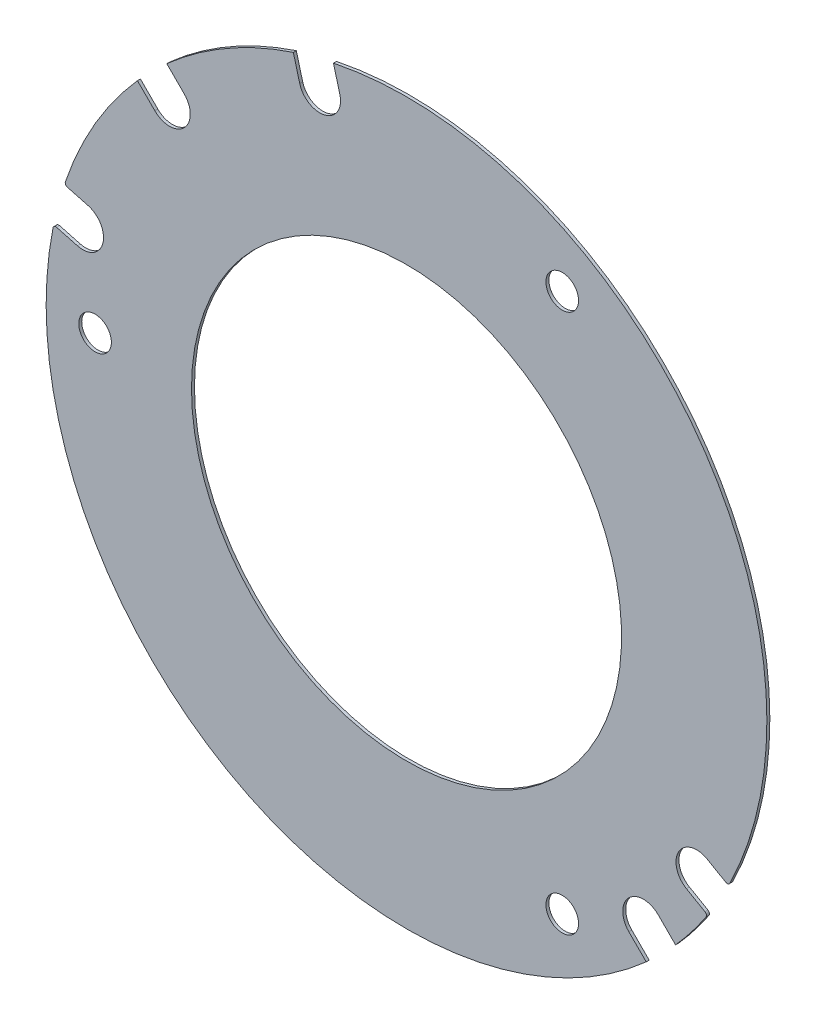
ISO-10303-21;
HEADER;
FILE_DESCRIPTION(('STEP AP214'),'2;1');
FILE_NAME('part.step','',(''),(''),'','','');
FILE_SCHEMA(('AUTOMOTIVE_DESIGN { 1 0 10303 214 1 1 1 1 }'));
ENDSEC;
DATA;
#1=APPLICATION_CONTEXT('core data for automotive mechanical design processes');
#2=APPLICATION_PROTOCOL_DEFINITION('international standard','automotive_design',2000,#1);
#3=PRODUCT_CONTEXT('',#1,'mechanical');
#4=PRODUCT('Part','Part','',(#3));
#5=PRODUCT_RELATED_PRODUCT_CATEGORY('part','',(#4));
#6=PRODUCT_DEFINITION_FORMATION('','',#4);
#7=PRODUCT_DEFINITION_CONTEXT('part definition',#1,'design');
#8=PRODUCT_DEFINITION('design','',#6,#7);
#9=PRODUCT_DEFINITION_SHAPE('','',#8);
#10=(LENGTH_UNIT() NAMED_UNIT(*) SI_UNIT(.MILLI.,.METRE.));
#11=(NAMED_UNIT(*) PLANE_ANGLE_UNIT() SI_UNIT($,.RADIAN.));
#12=(NAMED_UNIT(*) SI_UNIT($,.STERADIAN.) SOLID_ANGLE_UNIT());
#13=UNCERTAINTY_MEASURE_WITH_UNIT(LENGTH_MEASURE(1.E-05),#10,'distance_accuracy_value','');
#14=(GEOMETRIC_REPRESENTATION_CONTEXT(3) GLOBAL_UNCERTAINTY_ASSIGNED_CONTEXT((#13)) GLOBAL_UNIT_ASSIGNED_CONTEXT((#10,
#11,#12)) REPRESENTATION_CONTEXT('',''));
#15=CARTESIAN_POINT('',(0.,0.,0.));
#16=DIRECTION('',(0.,0.,1.));
#17=DIRECTION('',(1.,0.,0.));
#18=AXIS2_PLACEMENT_3D('',#15,#16,#17);
#19=CARTESIAN_POINT('',(0.,0.,0.));
#20=DIRECTION('',(0.,0.,-1.));
#21=DIRECTION('',(-1.,0.,0.));
#22=AXIS2_PLACEMENT_3D('',#19,#20,#21);
#23=PLANE('',#22);
#24=CARTESIAN_POINT('',(52.5,90.932667397366,0.));
#25=DIRECTION('',(0.,0.,-1.));
#26=DIRECTION('',(-1.,0.,0.));
#27=AXIS2_PLACEMENT_3D('',#24,#25,#26);
#28=CIRCLE('',#27,5.5);
#29=CARTESIAN_POINT('',(47.,90.932667397366,0.));
#30=VERTEX_POINT('',#29);
#31=EDGE_CURVE('E293',#30,#30,#28,.F.);
#32=ORIENTED_EDGE('',*,*,#31,.T.);
#33=EDGE_LOOP('',(#32));
#34=FACE_BOUND('',#33,.T.);
#35=CARTESIAN_POINT('',(52.5,-90.9326673973661,0.));
#36=DIRECTION('',(0.,0.,-1.));
#37=DIRECTION('',(-1.,0.,0.));
#38=AXIS2_PLACEMENT_3D('',#35,#36,#37);
#39=CIRCLE('',#38,5.5);
#40=CARTESIAN_POINT('',(47.,-90.9326673973661,0.));
#41=VERTEX_POINT('',#40);
#42=EDGE_CURVE('E296',#41,#41,#39,.F.);
#43=ORIENTED_EDGE('',*,*,#42,.T.);
#44=EDGE_LOOP('',(#43));
#45=FACE_BOUND('',#44,.T.);
#46=CARTESIAN_POINT('',(-105.,0.,0.));
#47=DIRECTION('',(0.,0.,-1.));
#48=DIRECTION('',(-1.,0.,0.));
#49=AXIS2_PLACEMENT_3D('',#46,#47,#48);
#50=CIRCLE('',#49,5.5);
#51=CARTESIAN_POINT('',(-110.5,0.,0.));
#52=VERTEX_POINT('',#51);
#53=EDGE_CURVE('E299',#52,#52,#50,.F.);
#54=ORIENTED_EDGE('',*,*,#53,.T.);
#55=EDGE_LOOP('',(#54));
#56=FACE_BOUND('',#55,.T.);
#57=CARTESIAN_POINT('',(0.,0.,0.));
#58=DIRECTION('',(0.,0.,-1.));
#59=DIRECTION('',(-1.,0.,0.));
#60=AXIS2_PLACEMENT_3D('',#57,#58,#59);
#61=CIRCLE('',#60,72.5);
#62=CARTESIAN_POINT('',(-72.5,0.,0.));
#63=VERTEX_POINT('',#62);
#64=EDGE_CURVE('E200',#63,#63,#61,.F.);
#65=ORIENTED_EDGE('',*,*,#64,.T.);
#66=EDGE_LOOP('',(#65));
#67=FACE_BOUND('',#66,.T.);
#68=DIRECTION('',(-0.707106781186546,0.707106781186549,0.));
#69=VECTOR('',#68,1.);
#70=CARTESIAN_POINT('',(84.8528137423857,-74.953318805774,0.));
#71=LINE('',#70,#69);
#72=CARTESIAN_POINT('',(90.7205175476283,-80.8210226110166,0.));
#73=VERTEX_POINT('',#72);
#74=CARTESIAN_POINT('',(84.8528137423857,-74.953318805774,0.));
#75=VERTEX_POINT('',#74);
#76=EDGE_CURVE('E201',#73,#75,#71,.T.);
#77=ORIENTED_EDGE('',*,*,#76,.T.);
#78=CARTESIAN_POINT('',(79.9030662740799,-79.9030662740799,0.));
#79=DIRECTION('',(0.,0.,1.));
#80=DIRECTION('',(1.,0.,0.));
#81=AXIS2_PLACEMENT_3D('',#78,#79,#80);
#82=CIRCLE('',#81,7.);
#83=CARTESIAN_POINT('',(74.9533188057741,-84.8528137423857,0.));
#84=VERTEX_POINT('',#83);
#85=EDGE_CURVE('E304',#75,#84,#82,.T.);
#86=ORIENTED_EDGE('',*,*,#85,.T.);
#87=DIRECTION('',(0.707106781186547,-0.707106781186548,0.));
#88=VECTOR('',#87,1.);
#89=CARTESIAN_POINT('',(80.8210226110167,-90.7205175476283,0.));
#90=LINE('',#89,#88);
#91=CARTESIAN_POINT('',(80.8210226110167,-90.7205175476283,0.));
#92=VERTEX_POINT('',#91);
#93=EDGE_CURVE('E186',#84,#92,#90,.T.);
#94=ORIENTED_EDGE('',*,*,#93,.T.);
#95=CARTESIAN_POINT('',(0.,0.,0.));
#96=DIRECTION('',(0.,0.,1.));
#97=DIRECTION('',(1.,0.,0.));
#98=AXIS2_PLACEMENT_3D('',#95,#96,#97);
#99=CIRCLE('',#98,121.5);
#100=CARTESIAN_POINT('',(-119.188797486006,23.5856005613564,0.));
#101=VERTEX_POINT('',#100);
#102=EDGE_CURVE('E19',#101,#92,#99,.T.);
#103=ORIENTED_EDGE('',*,*,#102,.F.);
#104=CARTESIAN_POINT('',(-118.20781972892,23.3914803921271,0.));
#105=DIRECTION('',(0.,0.,-1.));
#106=DIRECTION('',(-1.,0.,0.));
#107=AXIS2_PLACEMENT_3D('',#104,#105,#106);
#108=CIRCLE('',#107,1.);
#109=CARTESIAN_POINT('',(-117.949000683817,24.3574062184163,0.));
#110=VERTEX_POINT('',#109);
#111=EDGE_CURVE('E175',#110,#101,#108,.F.);
#112=ORIENTED_EDGE('',*,*,#111,.F.);
#113=DIRECTION('',(0.965925826289069,-0.25881904510252,0.));
#114=VECTOR('',#113,1.);
#115=CARTESIAN_POINT('',(-118.976784146226,24.6327999671628,0.));
#116=LINE('',#115,#114);
#117=CARTESIAN_POINT('',(-110.961351686382,22.4850713125614,0.));
#118=VERTEX_POINT('',#117);
#119=EDGE_CURVE('E193',#110,#118,#116,.T.);
#120=ORIENTED_EDGE('',*,*,#119,.T.);
#121=CARTESIAN_POINT('',(-109.149618370665,29.2465520965848,0.));
#122=DIRECTION('',(0.,0.,-1.));
#123=DIRECTION('',(-1.,0.,0.));
#124=AXIS2_PLACEMENT_3D('',#121,#122,#123);
#125=CIRCLE('',#124,7.);
#126=CARTESIAN_POINT('',(-107.337885054947,36.0080328806083,0.));
#127=VERTEX_POINT('',#126);
#128=EDGE_CURVE('E331',#118,#127,#125,.F.);
#129=ORIENTED_EDGE('',*,*,#128,.T.);
#130=DIRECTION('',(-0.965925826289068,0.258819045102521,0.));
#131=VECTOR('',#130,1.);
#132=CARTESIAN_POINT('',(-107.337885054947,36.0080328806083,0.));
#133=LINE('',#132,#131);
#134=CARTESIAN_POINT('',(-114.325534052382,37.8803677864631,0.));
#135=VERTEX_POINT('',#134);
#136=EDGE_CURVE('E231',#127,#135,#133,.T.);
#137=ORIENTED_EDGE('',*,*,#136,.T.);
#138=CARTESIAN_POINT('',(-114.066715007279,38.8462936127521,0.));
#139=DIRECTION('',(0.,0.,1.));
#140=DIRECTION('',(1.,0.,0.));
#141=AXIS2_PLACEMENT_3D('',#138,#139,#140);
#142=CIRCLE('',#141,1.);
#143=CARTESIAN_POINT('',(-115.013326750078,39.1686694933559,0.));
#144=VERTEX_POINT('',#143);
#145=EDGE_CURVE('E233',#144,#135,#142,.T.);
#146=ORIENTED_EDGE('',*,*,#145,.F.);
#147=CARTESIAN_POINT('',(0.,0.,0.));
#148=DIRECTION('',(0.,0.,1.));
#149=DIRECTION('',(1.,0.,0.));
#150=AXIS2_PLACEMENT_3D('',#147,#148,#149);
#151=CIRCLE('',#150,121.5);
#152=CARTESIAN_POINT('',(-90.7205175476283,80.8210226110166,0.));
#153=VERTEX_POINT('',#152);
#154=EDGE_CURVE('E326',#153,#144,#151,.T.);
#155=ORIENTED_EDGE('',*,*,#154,.F.);
#156=DIRECTION('',(0.707106781186548,-0.707106781186547,0.));
#157=VECTOR('',#156,1.);
#158=CARTESIAN_POINT('',(-90.7205175476283,80.8210226110166,0.));
#159=LINE('',#158,#157);
#160=CARTESIAN_POINT('',(-84.8528137423857,74.953318805774,0.));
#161=VERTEX_POINT('',#160);
#162=EDGE_CURVE('E227',#153,#161,#159,.T.);
#163=ORIENTED_EDGE('',*,*,#162,.T.);
#164=CARTESIAN_POINT('',(-79.9030662740799,79.9030662740799,0.));
#165=DIRECTION('',(0.,0.,-1.));
#166=DIRECTION('',(-1.,0.,0.));
#167=AXIS2_PLACEMENT_3D('',#164,#165,#166);
#168=CIRCLE('',#167,7.);
#169=CARTESIAN_POINT('',(-74.953318805774,84.8528137423857,0.));
#170=VERTEX_POINT('',#169);
#171=EDGE_CURVE('E324',#161,#170,#168,.F.);
#172=ORIENTED_EDGE('',*,*,#171,.T.);
#173=DIRECTION('',(-0.707106781186547,0.707106781186548,0.));
#174=VECTOR('',#173,1.);
#175=CARTESIAN_POINT('',(-74.953318805774,84.8528137423857,0.));
#176=LINE('',#175,#174);
#177=CARTESIAN_POINT('',(-80.8210226110166,90.7205175476283,0.));
#178=VERTEX_POINT('',#177);
#179=EDGE_CURVE('E223',#170,#178,#176,.T.);
#180=ORIENTED_EDGE('',*,*,#179,.T.);
#181=CARTESIAN_POINT('',(0.,0.,0.));
#182=DIRECTION('',(0.,0.,1.));
#183=DIRECTION('',(1.,0.,0.));
#184=AXIS2_PLACEMENT_3D('',#181,#182,#183);
#185=CIRCLE('',#184,121.5);
#186=CARTESIAN_POINT('',(-38.1557615352097,115.353317514791,0.));
#187=VERTEX_POINT('',#186);
#188=EDGE_CURVE('E321',#187,#178,#185,.T.);
#189=ORIENTED_EDGE('',*,*,#188,.F.);
#190=DIRECTION('',(0.258819045102522,-0.965925826289068,0.));
#191=VECTOR('',#190,1.);
#192=CARTESIAN_POINT('',(-38.1557615352097,115.353317514791,0.));
#193=LINE('',#192,#191);
#194=CARTESIAN_POINT('',(-36.0080328806083,107.337885054947,0.));
#195=VERTEX_POINT('',#194);
#196=EDGE_CURVE('E219',#187,#195,#193,.T.);
#197=ORIENTED_EDGE('',*,*,#196,.T.);
#198=CARTESIAN_POINT('',(-29.2465520965849,109.149618370665,0.));
#199=DIRECTION('',(0.,0.,-1.));
#200=DIRECTION('',(-1.,0.,0.));
#201=AXIS2_PLACEMENT_3D('',#198,#199,#200);
#202=CIRCLE('',#201,7.);
#203=CARTESIAN_POINT('',(-22.4850713125615,110.961351686382,0.));
#204=VERTEX_POINT('',#203);
#205=EDGE_CURVE('E319',#195,#204,#202,.F.);
#206=ORIENTED_EDGE('',*,*,#205,.T.);
#207=DIRECTION('',(-0.258819045102521,0.965925826289068,0.));
#208=VECTOR('',#207,1.);
#209=CARTESIAN_POINT('',(-22.4850713125614,110.961351686382,0.));
#210=LINE('',#209,#208);
#211=CARTESIAN_POINT('',(-24.6327999671629,118.976784146226,0.));
#212=VERTEX_POINT('',#211);
#213=EDGE_CURVE('E214',#204,#212,#210,.T.);
#214=ORIENTED_EDGE('',*,*,#213,.T.);
#215=CARTESIAN_POINT('',(0.,0.,0.));
#216=DIRECTION('',(0.,0.,1.));
#217=DIRECTION('',(1.,0.,0.));
#218=AXIS2_PLACEMENT_3D('',#215,#216,#217);
#219=CIRCLE('',#218,121.5);
#220=CARTESIAN_POINT('',(109.023135080611,-53.6302714629978,0.));
#221=VERTEX_POINT('',#220);
#222=EDGE_CURVE('E217',#221,#212,#219,.T.);
#223=ORIENTED_EDGE('',*,*,#222,.F.);
#224=CARTESIAN_POINT('',(108.125825326861,-53.1888700517797,0.));
#225=DIRECTION('',(0.,0.,-1.));
#226=DIRECTION('',(-1.,0.,0.));
#227=AXIS2_PLACEMENT_3D('',#224,#225,#226);
#228=CIRCLE('',#227,1.);
#229=CARTESIAN_POINT('',(107.625825326861,-54.0548954555639,0.));
#230=VERTEX_POINT('',#229);
#231=EDGE_CURVE('E315',#230,#221,#228,.F.);
#232=ORIENTED_EDGE('',*,*,#231,.F.);
#233=DIRECTION('',(-0.866025403784438,0.500000000000002,0.));
#234=VECTOR('',#233,1.);
#235=CARTESIAN_POINT('',(101.360870627642,-50.4378221735089,0.));
#236=LINE('',#235,#234);
#237=CARTESIAN_POINT('',(101.360870627642,-50.4378221735089,0.));
#238=VERTEX_POINT('',#237);
#239=EDGE_CURVE('E210',#230,#238,#236,.T.);
#240=ORIENTED_EDGE('',*,*,#239,.T.);
#241=CARTESIAN_POINT('',(97.8608706276416,-56.5,0.));
#242=DIRECTION('',(0.,0.,1.));
#243=DIRECTION('',(1.,0.,0.));
#244=AXIS2_PLACEMENT_3D('',#241,#242,#243);
#245=CIRCLE('',#244,7.);
#246=CARTESIAN_POINT('',(94.3608706276415,-62.5621778264912,0.));
#247=VERTEX_POINT('',#246);
#248=EDGE_CURVE('E312',#238,#247,#245,.T.);
#249=ORIENTED_EDGE('',*,*,#248,.T.);
#250=DIRECTION('',(0.866025403784439,-0.5,0.));
#251=VECTOR('',#250,1.);
#252=CARTESIAN_POINT('',(101.547310769957,-66.7112709771722,0.));
#253=LINE('',#252,#251);
#254=CARTESIAN_POINT('',(100.625825326861,-66.1792511085463,0.));
#255=VERTEX_POINT('',#254);
#256=EDGE_CURVE('E205',#247,#255,#253,.T.);
#257=ORIENTED_EDGE('',*,*,#256,.T.);
#258=CARTESIAN_POINT('',(100.125825326861,-67.0452765123307,0.));
#259=DIRECTION('',(0.,0.,1.));
#260=DIRECTION('',(1.,0.,0.));
#261=AXIS2_PLACEMENT_3D('',#258,#259,#260);
#262=CIRCLE('',#261,1.);
#263=CARTESIAN_POINT('',(100.956745039117,-67.6016688485327,0.));
#264=VERTEX_POINT('',#263);
#265=EDGE_CURVE('E208',#264,#255,#262,.T.);
#266=ORIENTED_EDGE('',*,*,#265,.F.);
#267=CARTESIAN_POINT('',(0.,0.,0.));
#268=DIRECTION('',(0.,0.,1.));
#269=DIRECTION('',(1.,0.,0.));
#270=AXIS2_PLACEMENT_3D('',#267,#268,#269);
#271=CIRCLE('',#270,121.5);
#272=EDGE_CURVE('E307',#73,#264,#271,.T.);
#273=ORIENTED_EDGE('',*,*,#272,.F.);
#274=EDGE_LOOP('',(#77,#86,#94,#103,#112,#120,#129,#137,#146,#155,#163,#172,#180,#189,#197,#206,
#214,#223,#232,#240,#249,#257,#266,#273));
#275=FACE_BOUND('',#274,.T.);
#276=ADVANCED_FACE('F16',(#34,#45,#56,#67,#275),#23,.T.);
#277=CARTESIAN_POINT('',(0.,0.,0.));
#278=DIRECTION('',(0.,0.,1.));
#279=DIRECTION('',(1.,0.,0.));
#280=AXIS2_PLACEMENT_3D('',#277,#278,#279);
#281=CYLINDRICAL_SURFACE('',#280,121.5);
#282=DIRECTION('',(0.,0.,-1.));
#283=VECTOR('',#282,1.);
#284=CARTESIAN_POINT('',(-119.188797486006,23.5856005613564,0.));
#285=LINE('',#284,#283);
#286=CARTESIAN_POINT('',(-119.188797486006,23.5856005613564,1.));
#287=VERTEX_POINT('',#286);
#288=EDGE_CURVE('E180',#101,#287,#285,.F.);
#289=ORIENTED_EDGE('',*,*,#288,.F.);
#290=ORIENTED_EDGE('',*,*,#102,.T.);
#291=DIRECTION('',(0.,0.,1.));
#292=VECTOR('',#291,1.);
#293=CARTESIAN_POINT('',(80.8210226110167,-90.7205175476283,1.));
#294=LINE('',#293,#292);
#295=CARTESIAN_POINT('',(80.8210226110167,-90.7205175476283,1.));
#296=VERTEX_POINT('',#295);
#297=EDGE_CURVE('E306',#92,#296,#294,.T.);
#298=ORIENTED_EDGE('',*,*,#297,.T.);
#299=CARTESIAN_POINT('',(0.,0.,1.));
#300=DIRECTION('',(0.,0.,1.));
#301=DIRECTION('',(1.,0.,0.));
#302=AXIS2_PLACEMENT_3D('',#299,#300,#301);
#303=CIRCLE('',#302,121.5);
#304=EDGE_CURVE('E192',#296,#287,#303,.F.);
#305=ORIENTED_EDGE('',*,*,#304,.T.);
#306=EDGE_LOOP('',(#289,#290,#298,#305));
#307=FACE_BOUND('',#306,.T.);
#308=ADVANCED_FACE('F191',(#307),#281,.T.);
#309=CARTESIAN_POINT('',(-118.20781972892,23.3914803921271,0.));
#310=DIRECTION('',(0.,0.,-1.));
#311=DIRECTION('',(-1.,0.,0.));
#312=AXIS2_PLACEMENT_3D('',#309,#310,#311);
#313=CYLINDRICAL_SURFACE('',#312,1.);
#314=CARTESIAN_POINT('',(-118.20781972892,23.3914803921271,1.));
#315=DIRECTION('',(0.,0.,-1.));
#316=DIRECTION('',(-1.,0.,0.));
#317=AXIS2_PLACEMENT_3D('',#314,#315,#316);
#318=CIRCLE('',#317,1.);
#319=CARTESIAN_POINT('',(-117.949000683817,24.3574062184162,1.));
#320=VERTEX_POINT('',#319);
#321=EDGE_CURVE('E290',#287,#320,#318,.T.);
#322=ORIENTED_EDGE('',*,*,#321,.T.);
#323=DIRECTION('',(0.,0.,1.));
#324=VECTOR('',#323,1.);
#325=CARTESIAN_POINT('',(-117.949000683817,24.3574062184162,1.));
#326=LINE('',#325,#324);
#327=EDGE_CURVE('E182',#320,#110,#326,.F.);
#328=ORIENTED_EDGE('',*,*,#327,.T.);
#329=ORIENTED_EDGE('',*,*,#111,.T.);
#330=ORIENTED_EDGE('',*,*,#288,.T.);
#331=EDGE_LOOP('',(#322,#328,#329,#330));
#332=FACE_BOUND('',#331,.T.);
#333=ADVANCED_FACE('F178',(#332),#313,.T.);
#334=CARTESIAN_POINT('',(-118.976784146226,24.6327999671628,1.));
#335=DIRECTION('',(-0.25881904510252,-0.965925826289069,0.));
#336=DIRECTION('',(0.965925826289069,-0.25881904510252,0.));
#337=AXIS2_PLACEMENT_3D('',#334,#335,#336);
#338=PLANE('',#337);
#339=DIRECTION('',(0.965925826289074,-0.258819045102501,0.));
#340=VECTOR('',#339,1.);
#341=CARTESIAN_POINT('',(-117.949000683817,24.3574062184161,1.));
#342=LINE('',#341,#340);
#343=CARTESIAN_POINT('',(-110.961351686382,22.4850713125613,1.));
#344=VERTEX_POINT('',#343);
#345=EDGE_CURVE('E289',#320,#344,#342,.T.);
#346=ORIENTED_EDGE('',*,*,#345,.T.);
#347=DIRECTION('',(0.,0.,-1.));
#348=VECTOR('',#347,1.);
#349=CARTESIAN_POINT('',(-110.961351686382,22.4850713125612,1.));
#350=LINE('',#349,#348);
#351=EDGE_CURVE('E332',#344,#118,#350,.T.);
#352=ORIENTED_EDGE('',*,*,#351,.T.);
#353=ORIENTED_EDGE('',*,*,#119,.F.);
#354=ORIENTED_EDGE('',*,*,#327,.F.);
#355=EDGE_LOOP('',(#346,#352,#353,#354));
#356=FACE_BOUND('',#355,.T.);
#357=ADVANCED_FACE('F474',(#356),#338,.F.);
#358=CARTESIAN_POINT('',(-109.149618370665,29.2465520965848,1.));
#359=DIRECTION('',(0.,0.,-1.));
#360=DIRECTION('',(-1.,0.,0.));
#361=AXIS2_PLACEMENT_3D('',#358,#359,#360);
#362=CYLINDRICAL_SURFACE('',#361,7.);
#363=ORIENTED_EDGE('',*,*,#351,.F.);
#364=CARTESIAN_POINT('',(-109.149618370665,29.2465520965848,1.));
#365=DIRECTION('',(0.,0.,-1.));
#366=DIRECTION('',(-1.,0.,0.));
#367=AXIS2_PLACEMENT_3D('',#364,#365,#366);
#368=CIRCLE('',#367,7.);
#369=CARTESIAN_POINT('',(-107.337885054947,36.0080328806083,1.));
#370=VERTEX_POINT('',#369);
#371=EDGE_CURVE('E286',#344,#370,#368,.F.);
#372=ORIENTED_EDGE('',*,*,#371,.T.);
#373=DIRECTION('',(0.,0.,1.));
#374=VECTOR('',#373,1.);
#375=CARTESIAN_POINT('',(-107.337885054947,36.0080328806083,1.));
#376=LINE('',#375,#374);
#377=EDGE_CURVE('E234',#370,#127,#376,.F.);
#378=ORIENTED_EDGE('',*,*,#377,.T.);
#379=ORIENTED_EDGE('',*,*,#128,.F.);
#380=EDGE_LOOP('',(#363,#372,#378,#379));
#381=FACE_BOUND('',#380,.T.);
#382=ADVANCED_FACE('F472',(#381),#362,.F.);
#383=CARTESIAN_POINT('',(-107.337885054947,36.0080328806083,1.));
#384=DIRECTION('',(0.258819045102521,0.965925826289068,0.));
#385=DIRECTION('',(-0.965925826289068,0.258819045102521,0.));
#386=AXIS2_PLACEMENT_3D('',#383,#384,#385);
#387=PLANE('',#386);
#388=ORIENTED_EDGE('',*,*,#136,.F.);
#389=ORIENTED_EDGE('',*,*,#377,.F.);
#390=DIRECTION('',(-0.96592582628907,0.258819045102515,0.));
#391=VECTOR('',#390,1.);
#392=CARTESIAN_POINT('',(-107.337885054947,36.0080328806083,1.));
#393=LINE('',#392,#391);
#394=CARTESIAN_POINT('',(-114.325534052382,37.8803677864631,1.));
#395=VERTEX_POINT('',#394);
#396=EDGE_CURVE('E285',#370,#395,#393,.T.);
#397=ORIENTED_EDGE('',*,*,#396,.T.);
#398=DIRECTION('',(0.,0.,1.));
#399=VECTOR('',#398,1.);
#400=CARTESIAN_POINT('',(-114.325534052382,37.8803677864632,0.));
#401=LINE('',#400,#399);
#402=EDGE_CURVE('E329',#135,#395,#401,.T.);
#403=ORIENTED_EDGE('',*,*,#402,.F.);
#404=EDGE_LOOP('',(#388,#389,#397,#403));
#405=FACE_BOUND('',#404,.T.);
#406=ADVANCED_FACE('F470',(#405),#387,.F.);
#407=CARTESIAN_POINT('',(-114.066715007279,38.8462936127521,0.));
#408=DIRECTION('',(0.,0.,1.));
#409=DIRECTION('',(1.,0.,0.));
#410=AXIS2_PLACEMENT_3D('',#407,#408,#409);
#411=CYLINDRICAL_SURFACE('',#410,1.);
#412=ORIENTED_EDGE('',*,*,#145,.T.);
#413=ORIENTED_EDGE('',*,*,#402,.T.);
#414=CARTESIAN_POINT('',(-114.066715007279,38.8462936127521,1.));
#415=DIRECTION('',(0.,0.,1.));
#416=DIRECTION('',(1.,0.,0.));
#417=AXIS2_PLACEMENT_3D('',#414,#415,#416);
#418=CIRCLE('',#417,1.);
#419=CARTESIAN_POINT('',(-115.013326750078,39.1686694933559,1.));
#420=VERTEX_POINT('',#419);
#421=EDGE_CURVE('E282',#395,#420,#418,.F.);
#422=ORIENTED_EDGE('',*,*,#421,.T.);
#423=DIRECTION('',(0.,0.,1.));
#424=VECTOR('',#423,1.);
#425=CARTESIAN_POINT('',(-115.013326750078,39.1686694933559,0.));
#426=LINE('',#425,#424);
#427=EDGE_CURVE('E328',#144,#420,#426,.T.);
#428=ORIENTED_EDGE('',*,*,#427,.F.);
#429=EDGE_LOOP('',(#412,#413,#422,#428));
#430=FACE_BOUND('',#429,.T.);
#431=ADVANCED_FACE('F465',(#430),#411,.T.);
#432=CARTESIAN_POINT('',(0.,0.,0.));
#433=DIRECTION('',(0.,0.,1.));
#434=DIRECTION('',(1.,0.,0.));
#435=AXIS2_PLACEMENT_3D('',#432,#433,#434);
#436=CYLINDRICAL_SURFACE('',#435,121.5);
#437=ORIENTED_EDGE('',*,*,#427,.T.);
#438=CARTESIAN_POINT('',(0.,0.,1.));
#439=DIRECTION('',(0.,0.,1.));
#440=DIRECTION('',(1.,0.,0.));
#441=AXIS2_PLACEMENT_3D('',#438,#439,#440);
#442=CIRCLE('',#441,121.5);
#443=CARTESIAN_POINT('',(-90.7205175476283,80.8210226110166,1.));
#444=VERTEX_POINT('',#443);
#445=EDGE_CURVE('E279',#420,#444,#442,.F.);
#446=ORIENTED_EDGE('',*,*,#445,.T.);
#447=DIRECTION('',(0.,0.,1.));
#448=VECTOR('',#447,1.);
#449=CARTESIAN_POINT('',(-90.7205175476283,80.8210226110166,1.));
#450=LINE('',#449,#448);
#451=EDGE_CURVE('E230',#444,#153,#450,.F.);
#452=ORIENTED_EDGE('',*,*,#451,.T.);
#453=ORIENTED_EDGE('',*,*,#154,.T.);
#454=EDGE_LOOP('',(#437,#446,#452,#453));
#455=FACE_BOUND('',#454,.T.);
#456=ADVANCED_FACE('F461',(#455),#436,.T.);
#457=CARTESIAN_POINT('',(-90.7205175476283,80.8210226110166,1.));
#458=DIRECTION('',(-0.707106781186547,-0.707106781186548,0.));
#459=DIRECTION('',(0.707106781186548,-0.707106781186547,0.));
#460=AXIS2_PLACEMENT_3D('',#457,#458,#459);
#461=PLANE('',#460);
#462=ORIENTED_EDGE('',*,*,#451,.F.);
#463=DIRECTION('',(0.707106781186548,-0.707106781186548,0.));
#464=VECTOR('',#463,1.);
#465=CARTESIAN_POINT('',(-90.7205175476283,80.8210226110166,1.));
#466=LINE('',#465,#464);
#467=CARTESIAN_POINT('',(-84.8528137423857,74.953318805774,1.));
#468=VERTEX_POINT('',#467);
#469=EDGE_CURVE('E278',#444,#468,#466,.T.);
#470=ORIENTED_EDGE('',*,*,#469,.T.);
#471=DIRECTION('',(0.,0.,-1.));
#472=VECTOR('',#471,1.);
#473=CARTESIAN_POINT('',(-84.8528137423857,74.953318805774,1.));
#474=LINE('',#473,#472);
#475=EDGE_CURVE('E229',#468,#161,#474,.T.);
#476=ORIENTED_EDGE('',*,*,#475,.T.);
#477=ORIENTED_EDGE('',*,*,#162,.F.);
#478=EDGE_LOOP('',(#462,#470,#476,#477));
#479=FACE_BOUND('',#478,.T.);
#480=ADVANCED_FACE('F457',(#479),#461,.F.);
#481=CARTESIAN_POINT('',(-79.9030662740799,79.9030662740799,1.));
#482=DIRECTION('',(0.,0.,-1.));
#483=DIRECTION('',(-1.,0.,0.));
#484=AXIS2_PLACEMENT_3D('',#481,#482,#483);
#485=CYLINDRICAL_SURFACE('',#484,7.);
#486=ORIENTED_EDGE('',*,*,#475,.F.);
#487=CARTESIAN_POINT('',(-79.9030662740799,79.9030662740799,1.));
#488=DIRECTION('',(0.,0.,-1.));
#489=DIRECTION('',(-1.,0.,0.));
#490=AXIS2_PLACEMENT_3D('',#487,#488,#489);
#491=CIRCLE('',#490,7.);
#492=CARTESIAN_POINT('',(-74.953318805774,84.8528137423857,1.));
#493=VERTEX_POINT('',#492);
#494=EDGE_CURVE('E275',#468,#493,#491,.F.);
#495=ORIENTED_EDGE('',*,*,#494,.T.);
#496=DIRECTION('',(0.,0.,1.));
#497=VECTOR('',#496,1.);
#498=CARTESIAN_POINT('',(-74.953318805774,84.8528137423857,1.));
#499=LINE('',#498,#497);
#500=EDGE_CURVE('E226',#493,#170,#499,.F.);
#501=ORIENTED_EDGE('',*,*,#500,.T.);
#502=ORIENTED_EDGE('',*,*,#171,.F.);
#503=EDGE_LOOP('',(#486,#495,#501,#502));
#504=FACE_BOUND('',#503,.T.);
#505=ADVANCED_FACE('F453',(#504),#485,.F.);
#506=CARTESIAN_POINT('',(-74.953318805774,84.8528137423857,1.));
#507=DIRECTION('',(0.707106781186548,0.707106781186547,0.));
#508=DIRECTION('',(-0.707106781186547,0.707106781186548,0.));
#509=AXIS2_PLACEMENT_3D('',#506,#507,#508);
#510=PLANE('',#509);
#511=ORIENTED_EDGE('',*,*,#500,.F.);
#512=DIRECTION('',(-0.707106781186553,0.707106781186542,0.));
#513=VECTOR('',#512,1.);
#514=CARTESIAN_POINT('',(-74.953318805774,84.8528137423857,1.));
#515=LINE('',#514,#513);
#516=CARTESIAN_POINT('',(-80.8210226110167,90.7205175476283,1.));
#517=VERTEX_POINT('',#516);
#518=EDGE_CURVE('E274',#493,#517,#515,.T.);
#519=ORIENTED_EDGE('',*,*,#518,.T.);
#520=DIRECTION('',(0.,0.,1.));
#521=VECTOR('',#520,1.);
#522=CARTESIAN_POINT('',(-80.8210226110167,90.7205175476283,0.));
#523=LINE('',#522,#521);
#524=EDGE_CURVE('E225',#178,#517,#523,.T.);
#525=ORIENTED_EDGE('',*,*,#524,.F.);
#526=ORIENTED_EDGE('',*,*,#179,.F.);
#527=EDGE_LOOP('',(#511,#519,#525,#526));
#528=FACE_BOUND('',#527,.T.);
#529=ADVANCED_FACE('F449',(#528),#510,.F.);
#530=CARTESIAN_POINT('',(0.,0.,0.));
#531=DIRECTION('',(0.,0.,1.));
#532=DIRECTION('',(1.,0.,0.));
#533=AXIS2_PLACEMENT_3D('',#530,#531,#532);
#534=CYLINDRICAL_SURFACE('',#533,121.5);
#535=DIRECTION('',(0.,0.,1.));
#536=VECTOR('',#535,1.);
#537=CARTESIAN_POINT('',(-38.1557615352097,115.353317514791,1.));
#538=LINE('',#537,#536);
#539=CARTESIAN_POINT('',(-38.1557615352097,115.353317514791,1.));
#540=VERTEX_POINT('',#539);
#541=EDGE_CURVE('E222',#540,#187,#538,.F.);
#542=ORIENTED_EDGE('',*,*,#541,.T.);
#543=ORIENTED_EDGE('',*,*,#188,.T.);
#544=ORIENTED_EDGE('',*,*,#524,.T.);
#545=CARTESIAN_POINT('',(0.,0.,1.));
#546=DIRECTION('',(0.,0.,1.));
#547=DIRECTION('',(1.,0.,0.));
#548=AXIS2_PLACEMENT_3D('',#545,#546,#547);
#549=CIRCLE('',#548,121.5);
#550=EDGE_CURVE('E271',#517,#540,#549,.F.);
#551=ORIENTED_EDGE('',*,*,#550,.T.);
#552=EDGE_LOOP('',(#542,#543,#544,#551));
#553=FACE_BOUND('',#552,.T.);
#554=ADVANCED_FACE('F445',(#553),#534,.T.);
#555=CARTESIAN_POINT('',(-38.1557615352097,115.353317514791,1.));
#556=DIRECTION('',(-0.965925826289068,-0.258819045102522,0.));
#557=DIRECTION('',(0.258819045102522,-0.965925826289068,0.));
#558=AXIS2_PLACEMENT_3D('',#555,#556,#557);
#559=PLANE('',#558);
#560=ORIENTED_EDGE('',*,*,#541,.F.);
#561=DIRECTION('',(0.25881904510252,-0.965925826289068,0.));
#562=VECTOR('',#561,1.);
#563=CARTESIAN_POINT('',(-38.1557615352097,115.353317514791,1.));
#564=LINE('',#563,#562);
#565=CARTESIAN_POINT('',(-36.0080328806083,107.337885054947,1.));
#566=VERTEX_POINT('',#565);
#567=EDGE_CURVE('E270',#540,#566,#564,.T.);
#568=ORIENTED_EDGE('',*,*,#567,.T.);
#569=DIRECTION('',(0.,0.,-1.));
#570=VECTOR('',#569,1.);
#571=CARTESIAN_POINT('',(-36.0080328806083,107.337885054947,1.));
#572=LINE('',#571,#570);
#573=EDGE_CURVE('E221',#566,#195,#572,.T.);
#574=ORIENTED_EDGE('',*,*,#573,.T.);
#575=ORIENTED_EDGE('',*,*,#196,.F.);
#576=EDGE_LOOP('',(#560,#568,#574,#575));
#577=FACE_BOUND('',#576,.T.);
#578=ADVANCED_FACE('F441',(#577),#559,.F.);
#579=CARTESIAN_POINT('',(-29.2465520965849,109.149618370665,1.));
#580=DIRECTION('',(0.,0.,-1.));
#581=DIRECTION('',(-1.,0.,0.));
#582=AXIS2_PLACEMENT_3D('',#579,#580,#581);
#583=CYLINDRICAL_SURFACE('',#582,7.);
#584=ORIENTED_EDGE('',*,*,#573,.F.);
#585=CARTESIAN_POINT('',(-29.2465520965849,109.149618370665,1.));
#586=DIRECTION('',(0.,0.,-1.));
#587=DIRECTION('',(-1.,0.,0.));
#588=AXIS2_PLACEMENT_3D('',#585,#586,#587);
#589=CIRCLE('',#588,7.);
#590=CARTESIAN_POINT('',(-22.4850713125615,110.961351686382,1.));
#591=VERTEX_POINT('',#590);
#592=EDGE_CURVE('E267',#566,#591,#589,.F.);
#593=ORIENTED_EDGE('',*,*,#592,.T.);
#594=DIRECTION('',(0.,0.,1.));
#595=VECTOR('',#594,1.);
#596=CARTESIAN_POINT('',(-22.4850713125614,110.961351686382,1.));
#597=LINE('',#596,#595);
#598=EDGE_CURVE('E218',#591,#204,#597,.F.);
#599=ORIENTED_EDGE('',*,*,#598,.T.);
#600=ORIENTED_EDGE('',*,*,#205,.F.);
#601=EDGE_LOOP('',(#584,#593,#599,#600));
#602=FACE_BOUND('',#601,.T.);
#603=ADVANCED_FACE('F437',(#602),#583,.F.);
#604=CARTESIAN_POINT('',(-22.4850713125614,110.961351686382,1.));
#605=DIRECTION('',(0.965925826289068,0.258819045102521,0.));
#606=DIRECTION('',(-0.258819045102521,0.965925826289068,0.));
#607=AXIS2_PLACEMENT_3D('',#604,#605,#606);
#608=PLANE('',#607);
#609=ORIENTED_EDGE('',*,*,#598,.F.);
#610=DIRECTION('',(-0.258819045102521,0.965925826289068,0.));
#611=VECTOR('',#610,1.);
#612=CARTESIAN_POINT('',(-22.4850713125614,110.961351686382,1.));
#613=LINE('',#612,#611);
#614=CARTESIAN_POINT('',(-24.6327999671629,118.976784146226,1.));
#615=VERTEX_POINT('',#614);
#616=EDGE_CURVE('E266',#591,#615,#613,.T.);
#617=ORIENTED_EDGE('',*,*,#616,.T.);
#618=DIRECTION('',(0.,0.,1.));
#619=VECTOR('',#618,1.);
#620=CARTESIAN_POINT('',(-24.6327999671629,118.976784146226,0.));
#621=LINE('',#620,#619);
#622=EDGE_CURVE('E317',#212,#615,#621,.T.);
#623=ORIENTED_EDGE('',*,*,#622,.F.);
#624=ORIENTED_EDGE('',*,*,#213,.F.);
#625=EDGE_LOOP('',(#609,#617,#623,#624));
#626=FACE_BOUND('',#625,.T.);
#627=ADVANCED_FACE('F433',(#626),#608,.F.);
#628=CARTESIAN_POINT('',(0.,0.,0.));
#629=DIRECTION('',(0.,0.,1.));
#630=DIRECTION('',(1.,0.,0.));
#631=AXIS2_PLACEMENT_3D('',#628,#629,#630);
#632=CYLINDRICAL_SURFACE('',#631,121.5);
#633=ORIENTED_EDGE('',*,*,#622,.T.);
#634=CARTESIAN_POINT('',(0.,0.,1.));
#635=DIRECTION('',(0.,0.,1.));
#636=DIRECTION('',(1.,0.,0.));
#637=AXIS2_PLACEMENT_3D('',#634,#635,#636);
#638=CIRCLE('',#637,121.5);
#639=CARTESIAN_POINT('',(109.023135080611,-53.6302714629978,1.));
#640=VERTEX_POINT('',#639);
#641=EDGE_CURVE('E263',#615,#640,#638,.F.);
#642=ORIENTED_EDGE('',*,*,#641,.T.);
#643=DIRECTION('',(0.,0.,-1.));
#644=VECTOR('',#643,1.);
#645=CARTESIAN_POINT('',(109.023135080611,-53.6302714629978,0.));
#646=LINE('',#645,#644);
#647=EDGE_CURVE('E213',#221,#640,#646,.F.);
#648=ORIENTED_EDGE('',*,*,#647,.F.);
#649=ORIENTED_EDGE('',*,*,#222,.T.);
#650=EDGE_LOOP('',(#633,#642,#648,#649));
#651=FACE_BOUND('',#650,.T.);
#652=ADVANCED_FACE('F429',(#651),#632,.T.);
#653=CARTESIAN_POINT('',(108.125825326861,-53.1888700517797,0.));
#654=DIRECTION('',(0.,0.,-1.));
#655=DIRECTION('',(-1.,0.,0.));
#656=AXIS2_PLACEMENT_3D('',#653,#654,#655);
#657=CYLINDRICAL_SURFACE('',#656,1.);
#658=CARTESIAN_POINT('',(108.125825326861,-53.1888700517797,1.));
#659=DIRECTION('',(0.,0.,-1.));
#660=DIRECTION('',(-1.,0.,0.));
#661=AXIS2_PLACEMENT_3D('',#658,#659,#660);
#662=CIRCLE('',#661,1.);
#663=CARTESIAN_POINT('',(107.625825326861,-54.054895455564,1.));
#664=VERTEX_POINT('',#663);
#665=EDGE_CURVE('E260',#640,#664,#662,.T.);
#666=ORIENTED_EDGE('',*,*,#665,.T.);
#667=DIRECTION('',(0.,0.,1.));
#668=VECTOR('',#667,1.);
#669=CARTESIAN_POINT('',(107.625825326861,-54.0548954555639,1.));
#670=LINE('',#669,#668);
#671=EDGE_CURVE('E212',#664,#230,#670,.F.);
#672=ORIENTED_EDGE('',*,*,#671,.T.);
#673=ORIENTED_EDGE('',*,*,#231,.T.);
#674=ORIENTED_EDGE('',*,*,#647,.T.);
#675=EDGE_LOOP('',(#666,#672,#673,#674));
#676=FACE_BOUND('',#675,.T.);
#677=ADVANCED_FACE('F423',(#676),#657,.T.);
#678=CARTESIAN_POINT('',(101.360870627642,-50.4378221735089,1.));
#679=DIRECTION('',(0.500000000000002,0.866025403784438,0.));
#680=DIRECTION('',(-0.866025403784438,0.500000000000002,0.));
#681=AXIS2_PLACEMENT_3D('',#678,#679,#680);
#682=PLANE('',#681);
#683=DIRECTION('',(-0.866025403784415,0.500000000000041,0.));
#684=VECTOR('',#683,1.);
#685=CARTESIAN_POINT('',(107.625825326861,-54.0548954555642,1.));
#686=LINE('',#685,#684);
#687=CARTESIAN_POINT('',(101.360870627642,-50.437822173509,1.));
#688=VERTEX_POINT('',#687);
#689=EDGE_CURVE('E259',#664,#688,#686,.T.);
#690=ORIENTED_EDGE('',*,*,#689,.T.);
#691=DIRECTION('',(0.,0.,1.));
#692=VECTOR('',#691,1.);
#693=CARTESIAN_POINT('',(101.360870627642,-50.4378221735091,1.));
#694=LINE('',#693,#692);
#695=EDGE_CURVE('E314',#688,#238,#694,.F.);
#696=ORIENTED_EDGE('',*,*,#695,.T.);
#697=ORIENTED_EDGE('',*,*,#239,.F.);
#698=ORIENTED_EDGE('',*,*,#671,.F.);
#699=EDGE_LOOP('',(#690,#696,#697,#698));
#700=FACE_BOUND('',#699,.T.);
#701=ADVANCED_FACE('F420',(#700),#682,.F.);
#702=CARTESIAN_POINT('',(97.8608706276416,-56.5,1.));
#703=DIRECTION('',(0.,0.,1.));
#704=DIRECTION('',(1.,0.,0.));
#705=AXIS2_PLACEMENT_3D('',#702,#703,#704);
#706=CYLINDRICAL_SURFACE('',#705,7.);
#707=ORIENTED_EDGE('',*,*,#695,.F.);
#708=CARTESIAN_POINT('',(97.8608706276416,-56.5,1.));
#709=DIRECTION('',(0.,0.,1.));
#710=DIRECTION('',(1.,0.,0.));
#711=AXIS2_PLACEMENT_3D('',#708,#709,#710);
#712=CIRCLE('',#711,7.);
#713=CARTESIAN_POINT('',(94.3608706276415,-62.5621778264912,1.));
#714=VERTEX_POINT('',#713);
#715=EDGE_CURVE('E256',#688,#714,#712,.T.);
#716=ORIENTED_EDGE('',*,*,#715,.T.);
#717=DIRECTION('',(0.,0.,1.));
#718=VECTOR('',#717,1.);
#719=CARTESIAN_POINT('',(94.3608706276415,-62.5621778264912,1.));
#720=LINE('',#719,#718);
#721=EDGE_CURVE('E209',#714,#247,#720,.F.);
#722=ORIENTED_EDGE('',*,*,#721,.T.);
#723=ORIENTED_EDGE('',*,*,#248,.F.);
#724=EDGE_LOOP('',(#707,#716,#722,#723));
#725=FACE_BOUND('',#724,.T.);
#726=ADVANCED_FACE('F416',(#725),#706,.F.);
#727=CARTESIAN_POINT('',(101.547310769957,-66.7112709771722,1.));
#728=DIRECTION('',(-0.5,-0.866025403784439,0.));
#729=DIRECTION('',(0.866025403784439,-0.5,0.));
#730=AXIS2_PLACEMENT_3D('',#727,#728,#729);
#731=PLANE('',#730);
#732=ORIENTED_EDGE('',*,*,#256,.F.);
#733=ORIENTED_EDGE('',*,*,#721,.F.);
#734=DIRECTION('',(0.866025403784436,-0.500000000000005,0.));
#735=VECTOR('',#734,1.);
#736=CARTESIAN_POINT('',(94.3608706276416,-62.5621778264911,1.));
#737=LINE('',#736,#735);
#738=CARTESIAN_POINT('',(100.625825326861,-66.1792511085463,1.));
#739=VERTEX_POINT('',#738);
#740=EDGE_CURVE('E255',#714,#739,#737,.T.);
#741=ORIENTED_EDGE('',*,*,#740,.T.);
#742=DIRECTION('',(0.,0.,1.));
#743=VECTOR('',#742,1.);
#744=CARTESIAN_POINT('',(100.625825326861,-66.1792511085463,0.));
#745=LINE('',#744,#743);
#746=EDGE_CURVE('E310',#255,#739,#745,.T.);
#747=ORIENTED_EDGE('',*,*,#746,.F.);
#748=EDGE_LOOP('',(#732,#733,#741,#747));
#749=FACE_BOUND('',#748,.T.);
#750=ADVANCED_FACE('F413',(#749),#731,.F.);
#751=CARTESIAN_POINT('',(100.125825326861,-67.0452765123307,0.));
#752=DIRECTION('',(0.,0.,1.));
#753=DIRECTION('',(1.,0.,0.));
#754=AXIS2_PLACEMENT_3D('',#751,#752,#753);
#755=CYLINDRICAL_SURFACE('',#754,1.);
#756=ORIENTED_EDGE('',*,*,#265,.T.);
#757=ORIENTED_EDGE('',*,*,#746,.T.);
#758=CARTESIAN_POINT('',(100.125825326861,-67.0452765123307,1.));
#759=DIRECTION('',(0.,0.,1.));
#760=DIRECTION('',(1.,0.,0.));
#761=AXIS2_PLACEMENT_3D('',#758,#759,#760);
#762=CIRCLE('',#761,1.);
#763=CARTESIAN_POINT('',(100.956745039117,-67.6016688485327,1.));
#764=VERTEX_POINT('',#763);
#765=EDGE_CURVE('E252',#739,#764,#762,.F.);
#766=ORIENTED_EDGE('',*,*,#765,.T.);
#767=DIRECTION('',(0.,0.,1.));
#768=VECTOR('',#767,1.);
#769=CARTESIAN_POINT('',(100.956745039117,-67.6016688485327,0.));
#770=LINE('',#769,#768);
#771=EDGE_CURVE('E309',#264,#764,#770,.T.);
#772=ORIENTED_EDGE('',*,*,#771,.F.);
#773=EDGE_LOOP('',(#756,#757,#766,#772));
#774=FACE_BOUND('',#773,.T.);
#775=ADVANCED_FACE('F407',(#774),#755,.T.);
#776=CARTESIAN_POINT('',(0.,0.,0.));
#777=DIRECTION('',(0.,0.,1.));
#778=DIRECTION('',(1.,0.,0.));
#779=AXIS2_PLACEMENT_3D('',#776,#777,#778);
#780=CYLINDRICAL_SURFACE('',#779,121.5);
#781=ORIENTED_EDGE('',*,*,#771,.T.);
#782=CARTESIAN_POINT('',(0.,0.,1.));
#783=DIRECTION('',(0.,0.,1.));
#784=DIRECTION('',(1.,0.,0.));
#785=AXIS2_PLACEMENT_3D('',#782,#783,#784);
#786=CIRCLE('',#785,121.5);
#787=CARTESIAN_POINT('',(90.7205175476283,-80.8210226110166,1.));
#788=VERTEX_POINT('',#787);
#789=EDGE_CURVE('E249',#764,#788,#786,.F.);
#790=ORIENTED_EDGE('',*,*,#789,.T.);
#791=DIRECTION('',(0.,0.,1.));
#792=VECTOR('',#791,1.);
#793=CARTESIAN_POINT('',(90.7205175476283,-80.8210226110166,1.));
#794=LINE('',#793,#792);
#795=EDGE_CURVE('E204',#788,#73,#794,.F.);
#796=ORIENTED_EDGE('',*,*,#795,.T.);
#797=ORIENTED_EDGE('',*,*,#272,.T.);
#798=EDGE_LOOP('',(#781,#790,#796,#797));
#799=FACE_BOUND('',#798,.T.);
#800=ADVANCED_FACE('F403',(#799),#780,.T.);
#801=CARTESIAN_POINT('',(84.8528137423857,-74.953318805774,1.));
#802=DIRECTION('',(0.707106781186549,0.707106781186546,0.));
#803=DIRECTION('',(-0.707106781186546,0.707106781186549,0.));
#804=AXIS2_PLACEMENT_3D('',#801,#802,#803);
#805=PLANE('',#804);
#806=ORIENTED_EDGE('',*,*,#795,.F.);
#807=DIRECTION('',(-0.707106781186548,0.707106781186548,0.));
#808=VECTOR('',#807,1.);
#809=CARTESIAN_POINT('',(90.7205175476283,-80.8210226110166,1.));
#810=LINE('',#809,#808);
#811=CARTESIAN_POINT('',(84.8528137423857,-74.953318805774,1.));
#812=VERTEX_POINT('',#811);
#813=EDGE_CURVE('E248',#788,#812,#810,.T.);
#814=ORIENTED_EDGE('',*,*,#813,.T.);
#815=DIRECTION('',(0.,0.,1.));
#816=VECTOR('',#815,1.);
#817=CARTESIAN_POINT('',(84.8528137423857,-74.953318805774,1.));
#818=LINE('',#817,#816);
#819=EDGE_CURVE('E203',#812,#75,#818,.F.);
#820=ORIENTED_EDGE('',*,*,#819,.T.);
#821=ORIENTED_EDGE('',*,*,#76,.F.);
#822=EDGE_LOOP('',(#806,#814,#820,#821));
#823=FACE_BOUND('',#822,.T.);
#824=ADVANCED_FACE('F399',(#823),#805,.F.);
#825=CARTESIAN_POINT('',(79.9030662740799,-79.9030662740799,1.));
#826=DIRECTION('',(0.,0.,1.));
#827=DIRECTION('',(1.,0.,0.));
#828=AXIS2_PLACEMENT_3D('',#825,#826,#827);
#829=CYLINDRICAL_SURFACE('',#828,7.);
#830=ORIENTED_EDGE('',*,*,#819,.F.);
#831=CARTESIAN_POINT('',(79.9030662740799,-79.9030662740799,1.));
#832=DIRECTION('',(0.,0.,1.));
#833=DIRECTION('',(1.,0.,0.));
#834=AXIS2_PLACEMENT_3D('',#831,#832,#833);
#835=CIRCLE('',#834,7.);
#836=CARTESIAN_POINT('',(74.9533188057741,-84.8528137423857,1.));
#837=VERTEX_POINT('',#836);
#838=EDGE_CURVE('E245',#812,#837,#835,.T.);
#839=ORIENTED_EDGE('',*,*,#838,.T.);
#840=DIRECTION('',(0.,0.,1.));
#841=VECTOR('',#840,1.);
#842=CARTESIAN_POINT('',(74.9533188057741,-84.8528137423857,1.));
#843=LINE('',#842,#841);
#844=EDGE_CURVE('E34',#837,#84,#843,.F.);
#845=ORIENTED_EDGE('',*,*,#844,.T.);
#846=ORIENTED_EDGE('',*,*,#85,.F.);
#847=EDGE_LOOP('',(#830,#839,#845,#846));
#848=FACE_BOUND('',#847,.T.);
#849=ADVANCED_FACE('F395',(#848),#829,.F.);
#850=CARTESIAN_POINT('',(80.8210226110167,-90.7205175476283,1.));
#851=DIRECTION('',(-0.707106781186548,-0.707106781186547,0.));
#852=DIRECTION('',(0.707106781186547,-0.707106781186548,0.));
#853=AXIS2_PLACEMENT_3D('',#850,#851,#852);
#854=PLANE('',#853);
#855=ORIENTED_EDGE('',*,*,#844,.F.);
#856=DIRECTION('',(0.707106781186548,-0.707106781186548,0.));
#857=VECTOR('',#856,1.);
#858=CARTESIAN_POINT('',(74.9533188057741,-84.8528137423857,1.));
#859=LINE('',#858,#857);
#860=EDGE_CURVE('E244',#837,#296,#859,.T.);
#861=ORIENTED_EDGE('',*,*,#860,.T.);
#862=ORIENTED_EDGE('',*,*,#297,.F.);
#863=ORIENTED_EDGE('',*,*,#93,.F.);
#864=EDGE_LOOP('',(#855,#861,#862,#863));
#865=FACE_BOUND('',#864,.T.);
#866=ADVANCED_FACE('F389',(#865),#854,.F.);
#867=CARTESIAN_POINT('',(0.,0.,1.));
#868=DIRECTION('',(0.,0.,-1.));
#869=DIRECTION('',(-1.,0.,0.));
#870=AXIS2_PLACEMENT_3D('',#867,#868,#869);
#871=CYLINDRICAL_SURFACE('',#870,72.5);
#872=CARTESIAN_POINT('',(0.,0.,1.));
#873=DIRECTION('',(0.,0.,-1.));
#874=DIRECTION('',(-1.,0.,0.));
#875=AXIS2_PLACEMENT_3D('',#872,#873,#874);
#876=CIRCLE('',#875,72.5);
#877=CARTESIAN_POINT('',(-72.5,0.,1.));
#878=VERTEX_POINT('',#877);
#879=EDGE_CURVE('E241',#878,#878,#876,.F.);
#880=ORIENTED_EDGE('',*,*,#879,.T.);
#881=EDGE_LOOP('',(#880));
#882=FACE_BOUND('',#881,.T.);
#883=ORIENTED_EDGE('',*,*,#64,.F.);
#884=EDGE_LOOP('',(#883));
#885=FACE_BOUND('',#884,.T.);
#886=ADVANCED_FACE('F503',(#882,#885),#871,.F.);
#887=CARTESIAN_POINT('',(-105.,0.,1.));
#888=DIRECTION('',(0.,0.,-1.));
#889=DIRECTION('',(-1.,0.,0.));
#890=AXIS2_PLACEMENT_3D('',#887,#888,#889);
#891=CYLINDRICAL_SURFACE('',#890,5.5);
#892=CARTESIAN_POINT('',(-105.,0.,1.));
#893=DIRECTION('',(0.,0.,-1.));
#894=DIRECTION('',(-1.,0.,0.));
#895=AXIS2_PLACEMENT_3D('',#892,#893,#894);
#896=CIRCLE('',#895,5.5);
#897=CARTESIAN_POINT('',(-110.5,0.,1.));
#898=VERTEX_POINT('',#897);
#899=EDGE_CURVE('E238',#898,#898,#896,.F.);
#900=ORIENTED_EDGE('',*,*,#899,.T.);
#901=EDGE_LOOP('',(#900));
#902=FACE_BOUND('',#901,.T.);
#903=ORIENTED_EDGE('',*,*,#53,.F.);
#904=EDGE_LOOP('',(#903));
#905=FACE_BOUND('',#904,.T.);
#906=ADVANCED_FACE('F499',(#902,#905),#891,.F.);
#907=CARTESIAN_POINT('',(52.5,-90.9326673973661,1.));
#908=DIRECTION('',(0.,0.,-1.));
#909=DIRECTION('',(-1.,0.,0.));
#910=AXIS2_PLACEMENT_3D('',#907,#908,#909);
#911=CYLINDRICAL_SURFACE('',#910,5.5);
#912=CARTESIAN_POINT('',(52.5,-90.9326673973661,1.));
#913=DIRECTION('',(0.,0.,-1.));
#914=DIRECTION('',(-1.,0.,0.));
#915=AXIS2_PLACEMENT_3D('',#912,#913,#914);
#916=CIRCLE('',#915,5.5);
#917=CARTESIAN_POINT('',(47.,-90.9326673973661,1.));
#918=VERTEX_POINT('',#917);
#919=EDGE_CURVE('E25',#918,#918,#916,.F.);
#920=ORIENTED_EDGE('',*,*,#919,.T.);
#921=EDGE_LOOP('',(#920));
#922=FACE_BOUND('',#921,.T.);
#923=ORIENTED_EDGE('',*,*,#42,.F.);
#924=EDGE_LOOP('',(#923));
#925=FACE_BOUND('',#924,.T.);
#926=ADVANCED_FACE('F491',(#922,#925),#911,.F.);
#927=CARTESIAN_POINT('',(52.5,90.932667397366,1.));
#928=DIRECTION('',(0.,0.,-1.));
#929=DIRECTION('',(-1.,0.,0.));
#930=AXIS2_PLACEMENT_3D('',#927,#928,#929);
#931=CYLINDRICAL_SURFACE('',#930,5.5);
#932=CARTESIAN_POINT('',(52.5,90.932667397366,1.));
#933=DIRECTION('',(0.,0.,-1.));
#934=DIRECTION('',(-1.,0.,0.));
#935=AXIS2_PLACEMENT_3D('',#932,#933,#934);
#936=CIRCLE('',#935,5.5);
#937=CARTESIAN_POINT('',(47.,90.932667397366,1.));
#938=VERTEX_POINT('',#937);
#939=EDGE_CURVE('E11',#938,#938,#936,.F.);
#940=ORIENTED_EDGE('',*,*,#939,.T.);
#941=EDGE_LOOP('',(#940));
#942=FACE_BOUND('',#941,.T.);
#943=ORIENTED_EDGE('',*,*,#31,.F.);
#944=EDGE_LOOP('',(#943));
#945=FACE_BOUND('',#944,.T.);
#946=ADVANCED_FACE('F485',(#942,#945),#931,.F.);
#947=CARTESIAN_POINT('',(0.,0.,1.));
#948=DIRECTION('',(0.,0.,-1.));
#949=DIRECTION('',(-1.,0.,0.));
#950=AXIS2_PLACEMENT_3D('',#947,#948,#949);
#951=PLANE('',#950);
#952=ORIENTED_EDGE('',*,*,#939,.F.);
#953=EDGE_LOOP('',(#952));
#954=FACE_BOUND('',#953,.T.);
#955=ORIENTED_EDGE('',*,*,#919,.F.);
#956=EDGE_LOOP('',(#955));
#957=FACE_BOUND('',#956,.T.);
#958=ORIENTED_EDGE('',*,*,#899,.F.);
#959=EDGE_LOOP('',(#958));
#960=FACE_BOUND('',#959,.T.);
#961=ORIENTED_EDGE('',*,*,#879,.F.);
#962=EDGE_LOOP('',(#961));
#963=FACE_BOUND('',#962,.T.);
#964=ORIENTED_EDGE('',*,*,#838,.F.);
#965=ORIENTED_EDGE('',*,*,#813,.F.);
#966=ORIENTED_EDGE('',*,*,#789,.F.);
#967=ORIENTED_EDGE('',*,*,#765,.F.);
#968=ORIENTED_EDGE('',*,*,#740,.F.);
#969=ORIENTED_EDGE('',*,*,#715,.F.);
#970=ORIENTED_EDGE('',*,*,#689,.F.);
#971=ORIENTED_EDGE('',*,*,#665,.F.);
#972=ORIENTED_EDGE('',*,*,#641,.F.);
#973=ORIENTED_EDGE('',*,*,#616,.F.);
#974=ORIENTED_EDGE('',*,*,#592,.F.);
#975=ORIENTED_EDGE('',*,*,#567,.F.);
#976=ORIENTED_EDGE('',*,*,#550,.F.);
#977=ORIENTED_EDGE('',*,*,#518,.F.);
#978=ORIENTED_EDGE('',*,*,#494,.F.);
#979=ORIENTED_EDGE('',*,*,#469,.F.);
#980=ORIENTED_EDGE('',*,*,#445,.F.);
#981=ORIENTED_EDGE('',*,*,#421,.F.);
#982=ORIENTED_EDGE('',*,*,#396,.F.);
#983=ORIENTED_EDGE('',*,*,#371,.F.);
#984=ORIENTED_EDGE('',*,*,#345,.F.);
#985=ORIENTED_EDGE('',*,*,#321,.F.);
#986=ORIENTED_EDGE('',*,*,#304,.F.);
#987=ORIENTED_EDGE('',*,*,#860,.F.);
#988=EDGE_LOOP('',(#964,#965,#966,#967,#968,#969,#970,#971,#972,#973,#974,#975,#976,#977,#978,
#979,#980,#981,#982,#983,#984,#985,#986,#987));
#989=FACE_BOUND('',#988,.T.);
#990=ADVANCED_FACE('F392',(#954,#957,#960,#963,#989),#951,.F.);
#991=CLOSED_SHELL('',(#276,#308,#333,#357,#382,#406,#431,#456,#480,#505,#529,#554,#578,#603,
#627,#652,#677,#701,#726,#750,#775,#800,#824,#849,#866,#886,#906,#926,#946,#990));
#992=MANIFOLD_SOLID_BREP('B1',#991);
#993=ADVANCED_BREP_SHAPE_REPRESENTATION('',(#18,#992),#14);
#994=SHAPE_DEFINITION_REPRESENTATION(#9,#993);
ENDSEC;
END-ISO-10303-21;
